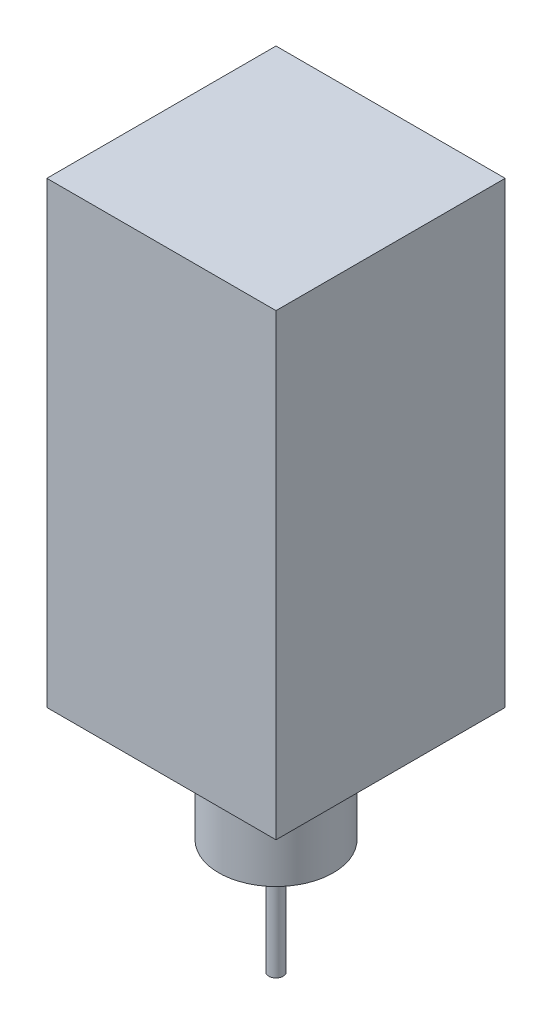
ISO-10303-21;
HEADER;
FILE_DESCRIPTION(('STEP AP214'),'2;1');
FILE_NAME('part.step','',(''),(''),'','','');
FILE_SCHEMA(('AUTOMOTIVE_DESIGN { 1 0 10303 214 1 1 1 1 }'));
ENDSEC;
DATA;
#1=APPLICATION_CONTEXT('core data for automotive mechanical design processes');
#2=APPLICATION_PROTOCOL_DEFINITION('international standard','automotive_design',2000,#1);
#3=PRODUCT_CONTEXT('',#1,'mechanical');
#4=PRODUCT('Part','Part','',(#3));
#5=PRODUCT_RELATED_PRODUCT_CATEGORY('part','',(#4));
#6=PRODUCT_DEFINITION_FORMATION('','',#4);
#7=PRODUCT_DEFINITION_CONTEXT('part definition',#1,'design');
#8=PRODUCT_DEFINITION('design','',#6,#7);
#9=PRODUCT_DEFINITION_SHAPE('','',#8);
#10=(LENGTH_UNIT() NAMED_UNIT(*) SI_UNIT(.MILLI.,.METRE.));
#11=(NAMED_UNIT(*) PLANE_ANGLE_UNIT() SI_UNIT($,.RADIAN.));
#12=(NAMED_UNIT(*) SI_UNIT($,.STERADIAN.) SOLID_ANGLE_UNIT());
#13=UNCERTAINTY_MEASURE_WITH_UNIT(LENGTH_MEASURE(1.E-05),#10,'distance_accuracy_value','');
#14=(GEOMETRIC_REPRESENTATION_CONTEXT(3) GLOBAL_UNCERTAINTY_ASSIGNED_CONTEXT((#13)) GLOBAL_UNIT_ASSIGNED_CONTEXT((#10,
#11,#12)) REPRESENTATION_CONTEXT('',''));
#15=CARTESIAN_POINT('',(0.,0.,0.));
#16=DIRECTION('',(0.,0.,1.));
#17=DIRECTION('',(1.,0.,0.));
#18=AXIS2_PLACEMENT_3D('',#15,#16,#17);
#19=CARTESIAN_POINT('',(0.,200.,0.));
#20=DIRECTION('',(1.,0.,0.));
#21=DIRECTION('',(0.,0.,-1.));
#22=AXIS2_PLACEMENT_3D('',#19,#20,#21);
#23=PLANE('',#22);
#24=DIRECTION('',(0.,0.,1.));
#25=VECTOR('',#24,1.);
#26=CARTESIAN_POINT('',(0.,0.,0.));
#27=LINE('',#26,#25);
#28=CARTESIAN_POINT('',(0.,0.,-100.));
#29=VERTEX_POINT('',#28);
#30=CARTESIAN_POINT('',(0.,0.,0.));
#31=VERTEX_POINT('',#30);
#32=EDGE_CURVE('E112',#29,#31,#27,.T.);
#33=ORIENTED_EDGE('',*,*,#32,.T.);
#34=DIRECTION('',(0.,-1.,0.));
#35=VECTOR('',#34,1.);
#36=CARTESIAN_POINT('',(0.,200.,0.));
#37=LINE('',#36,#35);
#38=CARTESIAN_POINT('',(0.,200.,0.));
#39=VERTEX_POINT('',#38);
#40=EDGE_CURVE('E44',#39,#31,#37,.T.);
#41=ORIENTED_EDGE('',*,*,#40,.F.);
#42=DIRECTION('',(0.,0.,1.));
#43=VECTOR('',#42,1.);
#44=CARTESIAN_POINT('',(0.,200.,0.));
#45=LINE('',#44,#43);
#46=CARTESIAN_POINT('',(0.,200.,-100.));
#47=VERTEX_POINT('',#46);
#48=EDGE_CURVE('E95',#47,#39,#45,.T.);
#49=ORIENTED_EDGE('',*,*,#48,.F.);
#50=DIRECTION('',(0.,-1.,0.));
#51=VECTOR('',#50,1.);
#52=CARTESIAN_POINT('',(0.,200.,-100.));
#53=LINE('',#52,#51);
#54=EDGE_CURVE('E108',#47,#29,#53,.T.);
#55=ORIENTED_EDGE('',*,*,#54,.T.);
#56=EDGE_LOOP('',(#33,#41,#49,#55));
#57=FACE_BOUND('',#56,.T.);
#58=ADVANCED_FACE('F41',(#57),#23,.F.);
#59=CARTESIAN_POINT('',(0.,200.,0.));
#60=DIRECTION('',(0.,0.,-1.));
#61=DIRECTION('',(-1.,0.,0.));
#62=AXIS2_PLACEMENT_3D('',#59,#60,#61);
#63=PLANE('',#62);
#64=DIRECTION('',(1.,0.,0.));
#65=VECTOR('',#64,1.);
#66=CARTESIAN_POINT('',(0.,0.,0.));
#67=LINE('',#66,#65);
#68=CARTESIAN_POINT('',(100.,0.,0.));
#69=VERTEX_POINT('',#68);
#70=EDGE_CURVE('E101',#31,#69,#67,.T.);
#71=ORIENTED_EDGE('',*,*,#70,.T.);
#72=DIRECTION('',(0.,-1.,0.));
#73=VECTOR('',#72,1.);
#74=CARTESIAN_POINT('',(100.,200.,0.));
#75=LINE('',#74,#73);
#76=CARTESIAN_POINT('',(100.,200.,0.));
#77=VERTEX_POINT('',#76);
#78=EDGE_CURVE('E99',#77,#69,#75,.T.);
#79=ORIENTED_EDGE('',*,*,#78,.F.);
#80=DIRECTION('',(1.,0.,0.));
#81=VECTOR('',#80,1.);
#82=CARTESIAN_POINT('',(0.,200.,0.));
#83=LINE('',#82,#81);
#84=EDGE_CURVE('E90',#39,#77,#83,.T.);
#85=ORIENTED_EDGE('',*,*,#84,.F.);
#86=ORIENTED_EDGE('',*,*,#40,.T.);
#87=EDGE_LOOP('',(#71,#79,#85,#86));
#88=FACE_BOUND('',#87,.T.);
#89=ADVANCED_FACE('F100',(#88),#63,.F.);
#90=CARTESIAN_POINT('',(100.,200.,0.));
#91=DIRECTION('',(-1.,0.,0.));
#92=DIRECTION('',(0.,0.,1.));
#93=AXIS2_PLACEMENT_3D('',#90,#91,#92);
#94=PLANE('',#93);
#95=DIRECTION('',(0.,0.,-1.));
#96=VECTOR('',#95,1.);
#97=CARTESIAN_POINT('',(100.,0.,0.));
#98=LINE('',#97,#96);
#99=CARTESIAN_POINT('',(100.,0.,-100.));
#100=VERTEX_POINT('',#99);
#101=EDGE_CURVE('E76',#69,#100,#98,.T.);
#102=ORIENTED_EDGE('',*,*,#101,.T.);
#103=DIRECTION('',(0.,-1.,0.));
#104=VECTOR('',#103,1.);
#105=CARTESIAN_POINT('',(100.,200.,-100.));
#106=LINE('',#105,#104);
#107=CARTESIAN_POINT('',(100.,200.,-100.));
#108=VERTEX_POINT('',#107);
#109=EDGE_CURVE('E103',#108,#100,#106,.T.);
#110=ORIENTED_EDGE('',*,*,#109,.F.);
#111=DIRECTION('',(0.,0.,-1.));
#112=VECTOR('',#111,1.);
#113=CARTESIAN_POINT('',(100.,200.,0.));
#114=LINE('',#113,#112);
#115=EDGE_CURVE('E93',#77,#108,#114,.T.);
#116=ORIENTED_EDGE('',*,*,#115,.F.);
#117=ORIENTED_EDGE('',*,*,#78,.T.);
#118=EDGE_LOOP('',(#102,#110,#116,#117));
#119=FACE_BOUND('',#118,.T.);
#120=ADVANCED_FACE('F104',(#119),#94,.F.);
#121=CARTESIAN_POINT('',(0.,200.,-100.));
#122=DIRECTION('',(0.,0.,1.));
#123=DIRECTION('',(1.,0.,0.));
#124=AXIS2_PLACEMENT_3D('',#121,#122,#123);
#125=PLANE('',#124);
#126=DIRECTION('',(-1.,0.,0.));
#127=VECTOR('',#126,1.);
#128=CARTESIAN_POINT('',(0.,0.,-100.));
#129=LINE('',#128,#127);
#130=EDGE_CURVE('E82',#100,#29,#129,.T.);
#131=ORIENTED_EDGE('',*,*,#130,.T.);
#132=ORIENTED_EDGE('',*,*,#54,.F.);
#133=DIRECTION('',(-1.,0.,0.));
#134=VECTOR('',#133,1.);
#135=CARTESIAN_POINT('',(0.,200.,-100.));
#136=LINE('',#135,#134);
#137=EDGE_CURVE('E59',#108,#47,#136,.T.);
#138=ORIENTED_EDGE('',*,*,#137,.F.);
#139=ORIENTED_EDGE('',*,*,#109,.T.);
#140=EDGE_LOOP('',(#131,#132,#138,#139));
#141=FACE_BOUND('',#140,.T.);
#142=ADVANCED_FACE('F126',(#141),#125,.F.);
#143=CARTESIAN_POINT('',(0.,200.,0.));
#144=DIRECTION('',(0.,-1.,0.));
#145=DIRECTION('',(0.,0.,-1.));
#146=AXIS2_PLACEMENT_3D('',#143,#144,#145);
#147=PLANE('',#146);
#148=ORIENTED_EDGE('',*,*,#48,.T.);
#149=ORIENTED_EDGE('',*,*,#84,.T.);
#150=ORIENTED_EDGE('',*,*,#115,.T.);
#151=ORIENTED_EDGE('',*,*,#137,.T.);
#152=EDGE_LOOP('',(#148,#149,#150,#151));
#153=FACE_BOUND('',#152,.T.);
#154=ADVANCED_FACE('F91',(#153),#147,.F.);
#155=CARTESIAN_POINT('',(0.,0.,0.));
#156=DIRECTION('',(0.,-1.,0.));
#157=DIRECTION('',(0.,0.,-1.));
#158=AXIS2_PLACEMENT_3D('',#155,#156,#157);
#159=PLANE('',#158);
#160=CARTESIAN_POINT('',(50.,0.,-50.));
#161=DIRECTION('',(0.,-1.,0.));
#162=DIRECTION('',(0.,0.,-1.));
#163=AXIS2_PLACEMENT_3D('',#160,#161,#162);
#164=CIRCLE('',#163,25.);
#165=CARTESIAN_POINT('',(50.,0.,-75.));
#166=VERTEX_POINT('',#165);
#167=EDGE_CURVE('E11',#166,#166,#164,.T.);
#168=ORIENTED_EDGE('',*,*,#167,.F.);
#169=EDGE_LOOP('',(#168));
#170=FACE_BOUND('',#169,.T.);
#171=ORIENTED_EDGE('',*,*,#32,.F.);
#172=ORIENTED_EDGE('',*,*,#130,.F.);
#173=ORIENTED_EDGE('',*,*,#101,.F.);
#174=ORIENTED_EDGE('',*,*,#70,.F.);
#175=EDGE_LOOP('',(#171,#172,#173,#174));
#176=FACE_BOUND('',#175,.T.);
#177=ADVANCED_FACE('F129',(#170,#176),#159,.T.);
#178=CARTESIAN_POINT('',(50.,-50.,-50.));
#179=DIRECTION('',(0.,1.,0.));
#180=DIRECTION('',(0.,0.,1.));
#181=AXIS2_PLACEMENT_3D('',#178,#179,#180);
#182=CYLINDRICAL_SURFACE('',#181,25.);
#183=CARTESIAN_POINT('',(50.,-50.,-50.));
#184=DIRECTION('',(0.,-1.,0.));
#185=DIRECTION('',(0.,0.,-1.));
#186=AXIS2_PLACEMENT_3D('',#183,#184,#185);
#187=CIRCLE('',#186,25.);
#188=CARTESIAN_POINT('',(50.,-50.,-75.));
#189=VERTEX_POINT('',#188);
#190=EDGE_CURVE('E116',#189,#189,#187,.T.);
#191=ORIENTED_EDGE('',*,*,#190,.F.);
#192=EDGE_LOOP('',(#191));
#193=FACE_BOUND('',#192,.T.);
#194=ORIENTED_EDGE('',*,*,#167,.T.);
#195=EDGE_LOOP('',(#194));
#196=FACE_BOUND('',#195,.T.);
#197=ADVANCED_FACE('F156',(#193,#196),#182,.T.);
#198=CARTESIAN_POINT('',(50.,-50.,-50.));
#199=DIRECTION('',(0.,-1.,0.));
#200=DIRECTION('',(0.,0.,-1.));
#201=AXIS2_PLACEMENT_3D('',#198,#199,#200);
#202=PLANE('',#201);
#203=CARTESIAN_POINT('',(50.,-50.,-50.));
#204=DIRECTION('',(0.,-1.,0.));
#205=DIRECTION('',(0.,0.,-1.));
#206=AXIS2_PLACEMENT_3D('',#203,#204,#205);
#207=CIRCLE('',#206,3.15);
#208=CARTESIAN_POINT('',(50.,-50.,-53.15));
#209=VERTEX_POINT('',#208);
#210=EDGE_CURVE('E137',#209,#209,#207,.T.);
#211=ORIENTED_EDGE('',*,*,#210,.F.);
#212=EDGE_LOOP('',(#211));
#213=FACE_BOUND('',#212,.T.);
#214=ORIENTED_EDGE('',*,*,#190,.T.);
#215=EDGE_LOOP('',(#214));
#216=FACE_BOUND('',#215,.T.);
#217=ADVANCED_FACE('F150',(#213,#216),#202,.T.);
#218=CARTESIAN_POINT('',(50.,-100.,-50.));
#219=DIRECTION('',(0.,1.,0.));
#220=DIRECTION('',(0.,0.,1.));
#221=AXIS2_PLACEMENT_3D('',#218,#219,#220);
#222=CYLINDRICAL_SURFACE('',#221,3.15);
#223=CARTESIAN_POINT('',(50.,-100.,-50.));
#224=DIRECTION('',(0.,-1.,0.));
#225=DIRECTION('',(0.,0.,-1.));
#226=AXIS2_PLACEMENT_3D('',#223,#224,#225);
#227=CIRCLE('',#226,3.15);
#228=CARTESIAN_POINT('',(50.,-100.,-53.15));
#229=VERTEX_POINT('',#228);
#230=EDGE_CURVE('E136',#229,#229,#227,.T.);
#231=ORIENTED_EDGE('',*,*,#230,.F.);
#232=EDGE_LOOP('',(#231));
#233=FACE_BOUND('',#232,.T.);
#234=ORIENTED_EDGE('',*,*,#210,.T.);
#235=EDGE_LOOP('',(#234));
#236=FACE_BOUND('',#235,.T.);
#237=ADVANCED_FACE('F147',(#233,#236),#222,.T.);
#238=CARTESIAN_POINT('',(50.,-100.,-50.));
#239=DIRECTION('',(0.,-1.,0.));
#240=DIRECTION('',(0.,0.,-1.));
#241=AXIS2_PLACEMENT_3D('',#238,#239,#240);
#242=PLANE('',#241);
#243=ORIENTED_EDGE('',*,*,#230,.T.);
#244=EDGE_LOOP('',(#243));
#245=FACE_BOUND('',#244,.T.);
#246=ADVANCED_FACE('F145',(#245),#242,.T.);
#247=CLOSED_SHELL('',(#58,#89,#120,#142,#154,#177,#197,#217,#237,#246));
#248=MANIFOLD_SOLID_BREP('B2',#247);
#249=ADVANCED_BREP_SHAPE_REPRESENTATION('',(#18,#248),#14);
#250=SHAPE_DEFINITION_REPRESENTATION(#9,#249);
ENDSEC;
END-ISO-10303-21;
